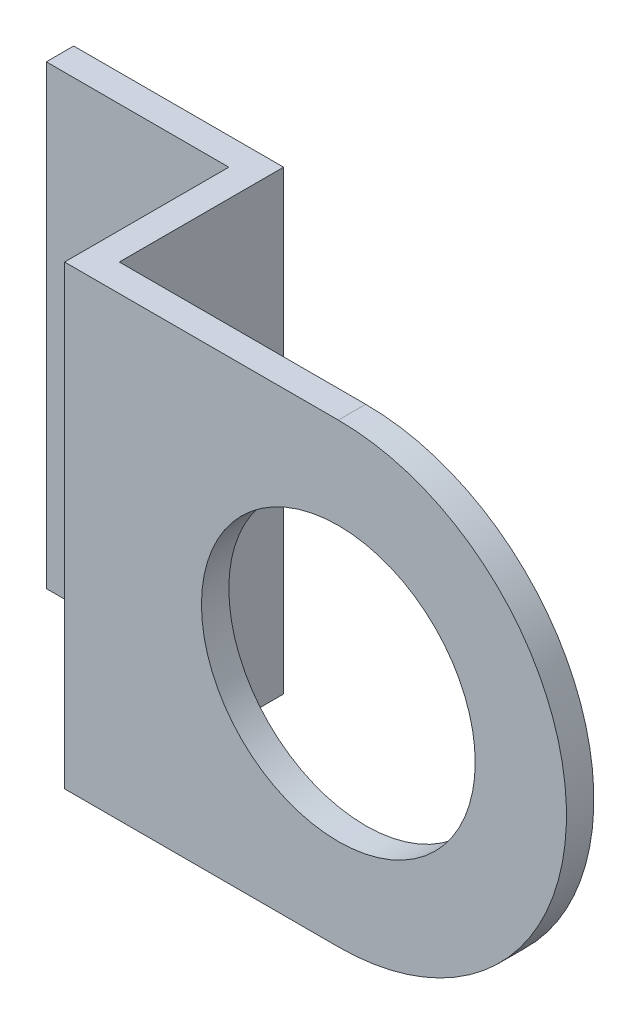
ISO-10303-21;
HEADER;
FILE_DESCRIPTION(('STEP AP214'),'2;1');
FILE_NAME('part.step','',(''),(''),'','','');
FILE_SCHEMA(('AUTOMOTIVE_DESIGN { 1 0 10303 214 1 1 1 1 }'));
ENDSEC;
DATA;
#1=APPLICATION_CONTEXT('core data for automotive mechanical design processes');
#2=APPLICATION_PROTOCOL_DEFINITION('international standard','automotive_design',2000,#1);
#3=PRODUCT_CONTEXT('',#1,'mechanical');
#4=PRODUCT('Part','Part','',(#3));
#5=PRODUCT_RELATED_PRODUCT_CATEGORY('part','',(#4));
#6=PRODUCT_DEFINITION_FORMATION('','',#4);
#7=PRODUCT_DEFINITION_CONTEXT('part definition',#1,'design');
#8=PRODUCT_DEFINITION('design','',#6,#7);
#9=PRODUCT_DEFINITION_SHAPE('','',#8);
#10=(LENGTH_UNIT() NAMED_UNIT(*) SI_UNIT(.MILLI.,.METRE.));
#11=(NAMED_UNIT(*) PLANE_ANGLE_UNIT() SI_UNIT($,.RADIAN.));
#12=(NAMED_UNIT(*) SI_UNIT($,.STERADIAN.) SOLID_ANGLE_UNIT());
#13=UNCERTAINTY_MEASURE_WITH_UNIT(LENGTH_MEASURE(1.E-05),#10,'distance_accuracy_value','');
#14=(GEOMETRIC_REPRESENTATION_CONTEXT(3) GLOBAL_UNCERTAINTY_ASSIGNED_CONTEXT((#13)) GLOBAL_UNIT_ASSIGNED_CONTEXT((#10,
#11,#12)) REPRESENTATION_CONTEXT('',''));
#15=CARTESIAN_POINT('',(0.,0.,0.));
#16=DIRECTION('',(0.,0.,1.));
#17=DIRECTION('',(1.,0.,0.));
#18=AXIS2_PLACEMENT_3D('',#15,#16,#17);
#19=CARTESIAN_POINT('',(60.,0.,0.));
#20=DIRECTION('',(0.,0.,1.));
#21=DIRECTION('',(1.,0.,0.));
#22=AXIS2_PLACEMENT_3D('',#19,#20,#21);
#23=PLANE('',#22);
#24=CARTESIAN_POINT('',(60.,0.,0.));
#25=DIRECTION('',(0.,0.,1.));
#26=DIRECTION('',(1.,0.,0.));
#27=AXIS2_PLACEMENT_3D('',#24,#25,#26);
#28=CIRCLE('',#27,30.);
#29=CARTESIAN_POINT('',(90.,0.,0.));
#30=VERTEX_POINT('',#29);
#31=EDGE_CURVE('E147',#30,#30,#28,.T.);
#32=ORIENTED_EDGE('',*,*,#31,.T.);
#33=EDGE_LOOP('',(#32));
#34=FACE_BOUND('',#33,.T.);
#35=DIRECTION('',(0.,-1.,0.));
#36=VECTOR('',#35,1.);
#37=CARTESIAN_POINT('',(6.00000000000001,50.,0.));
#38=LINE('',#37,#36);
#39=CARTESIAN_POINT('',(6.00000000000001,50.,0.));
#40=VERTEX_POINT('',#39);
#41=CARTESIAN_POINT('',(6.00000000000001,-50.,0.));
#42=VERTEX_POINT('',#41);
#43=EDGE_CURVE('E48',#40,#42,#38,.T.);
#44=ORIENTED_EDGE('',*,*,#43,.F.);
#45=DIRECTION('',(-1.,0.,0.));
#46=VECTOR('',#45,1.);
#47=CARTESIAN_POINT('',(60.,50.,0.));
#48=LINE('',#47,#46);
#49=CARTESIAN_POINT('',(60.,50.,0.));
#50=VERTEX_POINT('',#49);
#51=EDGE_CURVE('E110',#50,#40,#48,.T.);
#52=ORIENTED_EDGE('',*,*,#51,.F.);
#53=CARTESIAN_POINT('',(60.,0.,0.));
#54=DIRECTION('',(0.,0.,1.));
#55=DIRECTION('',(1.,0.,0.));
#56=AXIS2_PLACEMENT_3D('',#53,#54,#55);
#57=CIRCLE('',#56,50.);
#58=CARTESIAN_POINT('',(60.,-50.,0.));
#59=VERTEX_POINT('',#58);
#60=EDGE_CURVE('E151',#59,#50,#57,.T.);
#61=ORIENTED_EDGE('',*,*,#60,.F.);
#62=DIRECTION('',(1.,0.,0.));
#63=VECTOR('',#62,1.);
#64=CARTESIAN_POINT('',(0.,-50.,0.));
#65=LINE('',#64,#63);
#66=EDGE_CURVE('E70',#42,#59,#65,.T.);
#67=ORIENTED_EDGE('',*,*,#66,.F.);
#68=EDGE_LOOP('',(#44,#52,#61,#67));
#69=FACE_BOUND('',#68,.T.);
#70=ADVANCED_FACE('F33',(#34,#69),#23,.F.);
#71=CARTESIAN_POINT('',(60.,0.,6.));
#72=DIRECTION('',(0.,0.,1.));
#73=DIRECTION('',(1.,0.,0.));
#74=AXIS2_PLACEMENT_3D('',#71,#72,#73);
#75=PLANE('',#74);
#76=CARTESIAN_POINT('',(60.,0.,6.));
#77=DIRECTION('',(0.,0.,1.));
#78=DIRECTION('',(1.,0.,0.));
#79=AXIS2_PLACEMENT_3D('',#76,#77,#78);
#80=CIRCLE('',#79,50.);
#81=CARTESIAN_POINT('',(60.,-50.,6.));
#82=VERTEX_POINT('',#81);
#83=CARTESIAN_POINT('',(60.,50.,6.));
#84=VERTEX_POINT('',#83);
#85=EDGE_CURVE('E154',#82,#84,#80,.T.);
#86=ORIENTED_EDGE('',*,*,#85,.T.);
#87=DIRECTION('',(-1.,0.,0.));
#88=VECTOR('',#87,1.);
#89=CARTESIAN_POINT('',(60.,50.,6.));
#90=LINE('',#89,#88);
#91=CARTESIAN_POINT('',(0.,50.,6.));
#92=VERTEX_POINT('',#91);
#93=EDGE_CURVE('E77',#84,#92,#90,.T.);
#94=ORIENTED_EDGE('',*,*,#93,.T.);
#95=DIRECTION('',(0.,-1.,0.));
#96=VECTOR('',#95,1.);
#97=CARTESIAN_POINT('',(0.,50.,6.));
#98=LINE('',#97,#96);
#99=CARTESIAN_POINT('',(0.,-50.,6.));
#100=VERTEX_POINT('',#99);
#101=EDGE_CURVE('E157',#92,#100,#98,.T.);
#102=ORIENTED_EDGE('',*,*,#101,.T.);
#103=DIRECTION('',(1.,0.,0.));
#104=VECTOR('',#103,1.);
#105=CARTESIAN_POINT('',(0.,-50.,6.));
#106=LINE('',#105,#104);
#107=EDGE_CURVE('E57',#100,#82,#106,.T.);
#108=ORIENTED_EDGE('',*,*,#107,.T.);
#109=EDGE_LOOP('',(#86,#94,#102,#108));
#110=FACE_BOUND('',#109,.T.);
#111=CARTESIAN_POINT('',(60.,0.,6.));
#112=DIRECTION('',(0.,0.,1.));
#113=DIRECTION('',(1.,0.,0.));
#114=AXIS2_PLACEMENT_3D('',#111,#112,#113);
#115=CIRCLE('',#114,30.);
#116=CARTESIAN_POINT('',(90.,0.,6.));
#117=VERTEX_POINT('',#116);
#118=EDGE_CURVE('E148',#117,#117,#115,.T.);
#119=ORIENTED_EDGE('',*,*,#118,.F.);
#120=EDGE_LOOP('',(#119));
#121=FACE_BOUND('',#120,.T.);
#122=ADVANCED_FACE('F183',(#110,#121),#75,.T.);
#123=CARTESIAN_POINT('',(60.,0.,6.));
#124=DIRECTION('',(0.,0.,-1.));
#125=DIRECTION('',(-1.,0.,0.));
#126=AXIS2_PLACEMENT_3D('',#123,#124,#125);
#127=CYLINDRICAL_SURFACE('',#126,50.);
#128=ORIENTED_EDGE('',*,*,#60,.T.);
#129=DIRECTION('',(0.,0.,-1.));
#130=VECTOR('',#129,1.);
#131=CARTESIAN_POINT('',(60.,50.,6.));
#132=LINE('',#131,#130);
#133=EDGE_CURVE('E11',#84,#50,#132,.T.);
#134=ORIENTED_EDGE('',*,*,#133,.F.);
#135=ORIENTED_EDGE('',*,*,#85,.F.);
#136=DIRECTION('',(0.,0.,-1.));
#137=VECTOR('',#136,1.);
#138=CARTESIAN_POINT('',(60.,-50.,6.));
#139=LINE('',#138,#137);
#140=EDGE_CURVE('E160',#82,#59,#139,.T.);
#141=ORIENTED_EDGE('',*,*,#140,.T.);
#142=EDGE_LOOP('',(#128,#134,#135,#141));
#143=FACE_BOUND('',#142,.T.);
#144=ADVANCED_FACE('F35',(#143),#127,.T.);
#145=CARTESIAN_POINT('',(60.,50.,6.));
#146=DIRECTION('',(0.,-1.,0.));
#147=DIRECTION('',(1.,0.,0.));
#148=AXIS2_PLACEMENT_3D('',#145,#146,#147);
#149=PLANE('',#148);
#150=ORIENTED_EDGE('',*,*,#51,.T.);
#151=DIRECTION('',(0.,0.,-1.));
#152=VECTOR('',#151,1.);
#153=CARTESIAN_POINT('',(6.00000000000001,50.,-36.));
#154=LINE('',#153,#152);
#155=CARTESIAN_POINT('',(6.00000000000001,50.,-36.));
#156=VERTEX_POINT('',#155);
#157=EDGE_CURVE('E104',#40,#156,#154,.T.);
#158=ORIENTED_EDGE('',*,*,#157,.T.);
#159=DIRECTION('',(-1.,0.,0.));
#160=VECTOR('',#159,1.);
#161=CARTESIAN_POINT('',(-40.,50.,-36.));
#162=LINE('',#161,#160);
#163=CARTESIAN_POINT('',(-40.,50.,-36.));
#164=VERTEX_POINT('',#163);
#165=EDGE_CURVE('E108',#156,#164,#162,.T.);
#166=ORIENTED_EDGE('',*,*,#165,.T.);
#167=DIRECTION('',(0.,0.,1.));
#168=VECTOR('',#167,1.);
#169=CARTESIAN_POINT('',(-40.,50.,-30.));
#170=LINE('',#169,#168);
#171=CARTESIAN_POINT('',(-40.,50.,-30.));
#172=VERTEX_POINT('',#171);
#173=EDGE_CURVE('E125',#164,#172,#170,.T.);
#174=ORIENTED_EDGE('',*,*,#173,.T.);
#175=DIRECTION('',(1.,0.,0.));
#176=VECTOR('',#175,1.);
#177=CARTESIAN_POINT('',(0.,50.,-30.));
#178=LINE('',#177,#176);
#179=CARTESIAN_POINT('',(0.,50.,-30.));
#180=VERTEX_POINT('',#179);
#181=EDGE_CURVE('E127',#172,#180,#178,.T.);
#182=ORIENTED_EDGE('',*,*,#181,.T.);
#183=DIRECTION('',(0.,0.,-1.));
#184=VECTOR('',#183,1.);
#185=CARTESIAN_POINT('',(0.,50.,6.));
#186=LINE('',#185,#184);
#187=EDGE_CURVE('E41',#92,#180,#186,.T.);
#188=ORIENTED_EDGE('',*,*,#187,.F.);
#189=ORIENTED_EDGE('',*,*,#93,.F.);
#190=ORIENTED_EDGE('',*,*,#133,.T.);
#191=EDGE_LOOP('',(#150,#158,#166,#174,#182,#188,#189,#190));
#192=FACE_BOUND('',#191,.T.);
#193=ADVANCED_FACE('F106',(#192),#149,.F.);
#194=CARTESIAN_POINT('',(0.,50.,6.));
#195=DIRECTION('',(1.,0.,0.));
#196=DIRECTION('',(0.,1.,0.));
#197=AXIS2_PLACEMENT_3D('',#194,#195,#196);
#198=PLANE('',#197);
#199=ORIENTED_EDGE('',*,*,#187,.T.);
#200=DIRECTION('',(0.,-1.,0.));
#201=VECTOR('',#200,1.);
#202=CARTESIAN_POINT('',(0.,50.,-30.));
#203=LINE('',#202,#201);
#204=CARTESIAN_POINT('',(0.,-50.,-30.));
#205=VERTEX_POINT('',#204);
#206=EDGE_CURVE('E132',#180,#205,#203,.T.);
#207=ORIENTED_EDGE('',*,*,#206,.T.);
#208=DIRECTION('',(0.,0.,-1.));
#209=VECTOR('',#208,1.);
#210=CARTESIAN_POINT('',(0.,-50.,6.));
#211=LINE('',#210,#209);
#212=EDGE_CURVE('E166',#100,#205,#211,.T.);
#213=ORIENTED_EDGE('',*,*,#212,.F.);
#214=ORIENTED_EDGE('',*,*,#101,.F.);
#215=EDGE_LOOP('',(#199,#207,#213,#214));
#216=FACE_BOUND('',#215,.T.);
#217=ADVANCED_FACE('F169',(#216),#198,.F.);
#218=CARTESIAN_POINT('',(0.,-50.,6.));
#219=DIRECTION('',(0.,1.,0.));
#220=DIRECTION('',(0.,0.,1.));
#221=AXIS2_PLACEMENT_3D('',#218,#219,#220);
#222=PLANE('',#221);
#223=ORIENTED_EDGE('',*,*,#212,.T.);
#224=DIRECTION('',(1.,0.,0.));
#225=VECTOR('',#224,1.);
#226=CARTESIAN_POINT('',(0.,-50.,-30.));
#227=LINE('',#226,#225);
#228=CARTESIAN_POINT('',(-40.,-50.,-30.));
#229=VERTEX_POINT('',#228);
#230=EDGE_CURVE('E112',#229,#205,#227,.T.);
#231=ORIENTED_EDGE('',*,*,#230,.F.);
#232=DIRECTION('',(0.,0.,1.));
#233=VECTOR('',#232,1.);
#234=CARTESIAN_POINT('',(-40.,-50.,-30.));
#235=LINE('',#234,#233);
#236=CARTESIAN_POINT('',(-40.,-50.,-36.));
#237=VERTEX_POINT('',#236);
#238=EDGE_CURVE('E136',#237,#229,#235,.T.);
#239=ORIENTED_EDGE('',*,*,#238,.F.);
#240=DIRECTION('',(-1.,0.,0.));
#241=VECTOR('',#240,1.);
#242=CARTESIAN_POINT('',(-40.,-50.,-36.));
#243=LINE('',#242,#241);
#244=CARTESIAN_POINT('',(6.00000000000001,-50.,-36.));
#245=VERTEX_POINT('',#244);
#246=EDGE_CURVE('E134',#245,#237,#243,.T.);
#247=ORIENTED_EDGE('',*,*,#246,.F.);
#248=DIRECTION('',(0.,0.,-1.));
#249=VECTOR('',#248,1.);
#250=CARTESIAN_POINT('',(6.00000000000001,-50.,-36.));
#251=LINE('',#250,#249);
#252=EDGE_CURVE('E117',#42,#245,#251,.T.);
#253=ORIENTED_EDGE('',*,*,#252,.F.);
#254=ORIENTED_EDGE('',*,*,#66,.T.);
#255=ORIENTED_EDGE('',*,*,#140,.F.);
#256=ORIENTED_EDGE('',*,*,#107,.F.);
#257=EDGE_LOOP('',(#223,#231,#239,#247,#253,#254,#255,#256));
#258=FACE_BOUND('',#257,.T.);
#259=ADVANCED_FACE('F178',(#258),#222,.F.);
#260=CARTESIAN_POINT('',(60.,0.,6.));
#261=DIRECTION('',(0.,0.,-1.));
#262=DIRECTION('',(-1.,0.,0.));
#263=AXIS2_PLACEMENT_3D('',#260,#261,#262);
#264=CYLINDRICAL_SURFACE('',#263,30.);
#265=ORIENTED_EDGE('',*,*,#118,.T.);
#266=EDGE_LOOP('',(#265));
#267=FACE_BOUND('',#266,.T.);
#268=ORIENTED_EDGE('',*,*,#31,.F.);
#269=EDGE_LOOP('',(#268));
#270=FACE_BOUND('',#269,.T.);
#271=ADVANCED_FACE('F189',(#267,#270),#264,.F.);
#272=CARTESIAN_POINT('',(6.00000000000001,50.,-36.));
#273=DIRECTION('',(-1.,0.,0.));
#274=DIRECTION('',(0.,0.,1.));
#275=AXIS2_PLACEMENT_3D('',#272,#273,#274);
#276=PLANE('',#275);
#277=ORIENTED_EDGE('',*,*,#252,.T.);
#278=DIRECTION('',(0.,-1.,0.));
#279=VECTOR('',#278,1.);
#280=CARTESIAN_POINT('',(6.00000000000001,50.,-36.));
#281=LINE('',#280,#279);
#282=EDGE_CURVE('E115',#156,#245,#281,.T.);
#283=ORIENTED_EDGE('',*,*,#282,.F.);
#284=ORIENTED_EDGE('',*,*,#157,.F.);
#285=ORIENTED_EDGE('',*,*,#43,.T.);
#286=EDGE_LOOP('',(#277,#283,#284,#285));
#287=FACE_BOUND('',#286,.T.);
#288=ADVANCED_FACE('F116',(#287),#276,.F.);
#289=CARTESIAN_POINT('',(-40.,50.,-36.));
#290=DIRECTION('',(0.,0.,1.));
#291=DIRECTION('',(1.,0.,0.));
#292=AXIS2_PLACEMENT_3D('',#289,#290,#291);
#293=PLANE('',#292);
#294=ORIENTED_EDGE('',*,*,#246,.T.);
#295=DIRECTION('',(0.,-1.,0.));
#296=VECTOR('',#295,1.);
#297=CARTESIAN_POINT('',(-40.,50.,-36.));
#298=LINE('',#297,#296);
#299=EDGE_CURVE('E120',#164,#237,#298,.T.);
#300=ORIENTED_EDGE('',*,*,#299,.F.);
#301=ORIENTED_EDGE('',*,*,#165,.F.);
#302=ORIENTED_EDGE('',*,*,#282,.T.);
#303=EDGE_LOOP('',(#294,#300,#301,#302));
#304=FACE_BOUND('',#303,.T.);
#305=ADVANCED_FACE('F122',(#304),#293,.F.);
#306=CARTESIAN_POINT('',(-40.,50.,-30.));
#307=DIRECTION('',(1.,0.,0.));
#308=DIRECTION('',(0.,0.,-1.));
#309=AXIS2_PLACEMENT_3D('',#306,#307,#308);
#310=PLANE('',#309);
#311=ORIENTED_EDGE('',*,*,#238,.T.);
#312=DIRECTION('',(0.,-1.,0.));
#313=VECTOR('',#312,1.);
#314=CARTESIAN_POINT('',(-40.,50.,-30.));
#315=LINE('',#314,#313);
#316=EDGE_CURVE('E142',#172,#229,#315,.T.);
#317=ORIENTED_EDGE('',*,*,#316,.F.);
#318=ORIENTED_EDGE('',*,*,#173,.F.);
#319=ORIENTED_EDGE('',*,*,#299,.T.);
#320=EDGE_LOOP('',(#311,#317,#318,#319));
#321=FACE_BOUND('',#320,.T.);
#322=ADVANCED_FACE('F266',(#321),#310,.F.);
#323=CARTESIAN_POINT('',(0.,50.,-30.));
#324=DIRECTION('',(0.,0.,-1.));
#325=DIRECTION('',(-1.,0.,0.));
#326=AXIS2_PLACEMENT_3D('',#323,#324,#325);
#327=PLANE('',#326);
#328=ORIENTED_EDGE('',*,*,#230,.T.);
#329=ORIENTED_EDGE('',*,*,#206,.F.);
#330=ORIENTED_EDGE('',*,*,#181,.F.);
#331=ORIENTED_EDGE('',*,*,#316,.T.);
#332=EDGE_LOOP('',(#328,#329,#330,#331));
#333=FACE_BOUND('',#332,.T.);
#334=ADVANCED_FACE('F175',(#333),#327,.F.);
#335=CLOSED_SHELL('',(#70,#122,#144,#193,#217,#259,#271,#288,#305,#322,#334));
#336=MANIFOLD_SOLID_BREP('B2',#335);
#337=ADVANCED_BREP_SHAPE_REPRESENTATION('',(#18,#336),#14);
#338=SHAPE_DEFINITION_REPRESENTATION(#9,#337);
ENDSEC;
END-ISO-10303-21;
